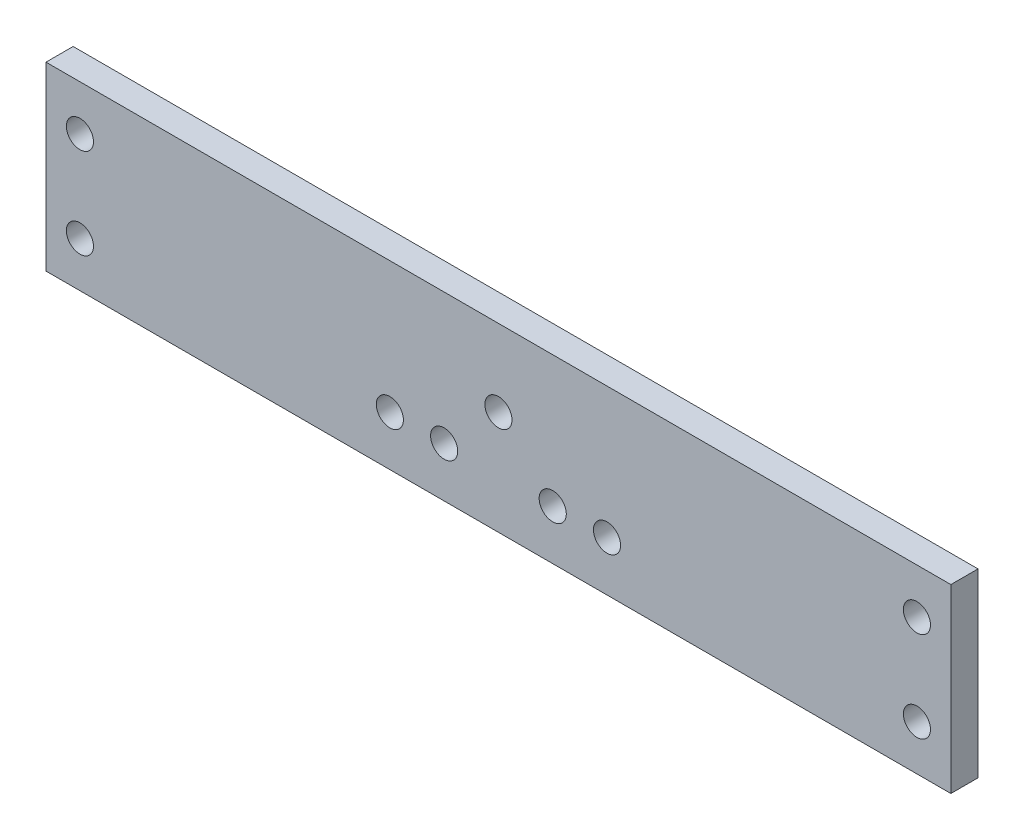
ISO-10303-21;
HEADER;
FILE_DESCRIPTION(('STEP AP214'),'2;1');
FILE_NAME('part.step','',(''),(''),'','','');
FILE_SCHEMA(('AUTOMOTIVE_DESIGN { 1 0 10303 214 1 1 1 1 }'));
ENDSEC;
DATA;
#1=APPLICATION_CONTEXT('core data for automotive mechanical design processes');
#2=APPLICATION_PROTOCOL_DEFINITION('international standard','automotive_design',2000,#1);
#3=PRODUCT_CONTEXT('',#1,'mechanical');
#4=PRODUCT('Part','Part','',(#3));
#5=PRODUCT_RELATED_PRODUCT_CATEGORY('part','',(#4));
#6=PRODUCT_DEFINITION_FORMATION('','',#4);
#7=PRODUCT_DEFINITION_CONTEXT('part definition',#1,'design');
#8=PRODUCT_DEFINITION('design','',#6,#7);
#9=PRODUCT_DEFINITION_SHAPE('','',#8);
#10=(LENGTH_UNIT() NAMED_UNIT(*) SI_UNIT(.MILLI.,.METRE.));
#11=(NAMED_UNIT(*) PLANE_ANGLE_UNIT() SI_UNIT($,.RADIAN.));
#12=(NAMED_UNIT(*) SI_UNIT($,.STERADIAN.) SOLID_ANGLE_UNIT());
#13=UNCERTAINTY_MEASURE_WITH_UNIT(LENGTH_MEASURE(1.E-05),#10,'distance_accuracy_value','');
#14=(GEOMETRIC_REPRESENTATION_CONTEXT(3) GLOBAL_UNCERTAINTY_ASSIGNED_CONTEXT((#13)) GLOBAL_UNIT_ASSIGNED_CONTEXT((#10,
#11,#12)) REPRESENTATION_CONTEXT('',''));
#15=CARTESIAN_POINT('',(0.,0.,0.));
#16=DIRECTION('',(0.,0.,1.));
#17=DIRECTION('',(1.,0.,0.));
#18=AXIS2_PLACEMENT_3D('',#15,#16,#17);
#19=CARTESIAN_POINT('',(0.,-10.,3.));
#20=DIRECTION('',(0.,1.,0.));
#21=DIRECTION('',(-1.,0.,0.));
#22=AXIS2_PLACEMENT_3D('',#19,#20,#21);
#23=PLANE('',#22);
#24=DIRECTION('',(1.,0.,0.));
#25=VECTOR('',#24,1.);
#26=CARTESIAN_POINT('',(0.,-10.,0.));
#27=LINE('',#26,#25);
#28=CARTESIAN_POINT('',(-50.,-9.99999999999999,0.));
#29=VERTEX_POINT('',#28);
#30=CARTESIAN_POINT('',(50.,-10.,0.));
#31=VERTEX_POINT('',#30);
#32=EDGE_CURVE('E146',#29,#31,#27,.T.);
#33=ORIENTED_EDGE('',*,*,#32,.T.);
#34=DIRECTION('',(0.,0.,-1.));
#35=VECTOR('',#34,1.);
#36=CARTESIAN_POINT('',(50.,-10.,3.));
#37=LINE('',#36,#35);
#38=CARTESIAN_POINT('',(50.,-10.,3.));
#39=VERTEX_POINT('',#38);
#40=EDGE_CURVE('E11',#39,#31,#37,.T.);
#41=ORIENTED_EDGE('',*,*,#40,.F.);
#42=DIRECTION('',(1.,0.,0.));
#43=VECTOR('',#42,1.);
#44=CARTESIAN_POINT('',(0.,-10.,3.));
#45=LINE('',#44,#43);
#46=CARTESIAN_POINT('',(-50.,-9.99999999999999,3.));
#47=VERTEX_POINT('',#46);
#48=EDGE_CURVE('E92',#47,#39,#45,.T.);
#49=ORIENTED_EDGE('',*,*,#48,.F.);
#50=DIRECTION('',(0.,0.,-1.));
#51=VECTOR('',#50,1.);
#52=CARTESIAN_POINT('',(-50.,-9.99999999999999,3.));
#53=LINE('',#52,#51);
#54=EDGE_CURVE('E59',#47,#29,#53,.T.);
#55=ORIENTED_EDGE('',*,*,#54,.T.);
#56=EDGE_LOOP('',(#33,#41,#49,#55));
#57=FACE_BOUND('',#56,.T.);
#58=ADVANCED_FACE('F41',(#57),#23,.F.);
#59=CARTESIAN_POINT('',(50.,0.,3.));
#60=DIRECTION('',(-1.,0.,0.));
#61=DIRECTION('',(0.,0.,1.));
#62=AXIS2_PLACEMENT_3D('',#59,#60,#61);
#63=PLANE('',#62);
#64=DIRECTION('',(0.,1.,0.));
#65=VECTOR('',#64,1.);
#66=CARTESIAN_POINT('',(50.,0.,0.));
#67=LINE('',#66,#65);
#68=CARTESIAN_POINT('',(50.,10.,0.));
#69=VERTEX_POINT('',#68);
#70=EDGE_CURVE('E98',#31,#69,#67,.T.);
#71=ORIENTED_EDGE('',*,*,#70,.T.);
#72=DIRECTION('',(0.,0.,-1.));
#73=VECTOR('',#72,1.);
#74=CARTESIAN_POINT('',(50.,10.,3.));
#75=LINE('',#74,#73);
#76=CARTESIAN_POINT('',(50.,10.,3.));
#77=VERTEX_POINT('',#76);
#78=EDGE_CURVE('E51',#77,#69,#75,.T.);
#79=ORIENTED_EDGE('',*,*,#78,.F.);
#80=DIRECTION('',(0.,1.,0.));
#81=VECTOR('',#80,1.);
#82=CARTESIAN_POINT('',(50.,0.,3.));
#83=LINE('',#82,#81);
#84=EDGE_CURVE('E84',#39,#77,#83,.T.);
#85=ORIENTED_EDGE('',*,*,#84,.F.);
#86=ORIENTED_EDGE('',*,*,#40,.T.);
#87=EDGE_LOOP('',(#71,#79,#85,#86));
#88=FACE_BOUND('',#87,.T.);
#89=ADVANCED_FACE('F97',(#88),#63,.F.);
#90=CARTESIAN_POINT('',(0.,10.,3.));
#91=DIRECTION('',(0.,1.,0.));
#92=DIRECTION('',(0.,0.,1.));
#93=AXIS2_PLACEMENT_3D('',#90,#91,#92);
#94=PLANE('',#93);
#95=DIRECTION('',(1.,0.,0.));
#96=VECTOR('',#95,1.);
#97=CARTESIAN_POINT('',(0.,10.,0.));
#98=LINE('',#97,#96);
#99=CARTESIAN_POINT('',(-50.,9.99999999999999,0.));
#100=VERTEX_POINT('',#99);
#101=EDGE_CURVE('E151',#100,#69,#98,.T.);
#102=ORIENTED_EDGE('',*,*,#101,.F.);
#103=DIRECTION('',(0.,0.,-1.));
#104=VECTOR('',#103,1.);
#105=CARTESIAN_POINT('',(-50.,9.99999999999999,3.));
#106=LINE('',#105,#104);
#107=CARTESIAN_POINT('',(-50.,9.99999999999999,3.));
#108=VERTEX_POINT('',#107);
#109=EDGE_CURVE('E73',#108,#100,#106,.T.);
#110=ORIENTED_EDGE('',*,*,#109,.F.);
#111=DIRECTION('',(1.,0.,0.));
#112=VECTOR('',#111,1.);
#113=CARTESIAN_POINT('',(0.,10.,3.));
#114=LINE('',#113,#112);
#115=EDGE_CURVE('E91',#108,#77,#114,.T.);
#116=ORIENTED_EDGE('',*,*,#115,.T.);
#117=ORIENTED_EDGE('',*,*,#78,.T.);
#118=EDGE_LOOP('',(#102,#110,#116,#117));
#119=FACE_BOUND('',#118,.T.);
#120=ADVANCED_FACE('F102',(#119),#94,.T.);
#121=CARTESIAN_POINT('',(46.25,5.,3.));
#122=DIRECTION('',(0.,0.,-1.));
#123=DIRECTION('',(-1.,0.,0.));
#124=AXIS2_PLACEMENT_3D('',#121,#122,#123);
#125=CYLINDRICAL_SURFACE('',#124,1.5);
#126=CARTESIAN_POINT('',(46.25,5.,3.));
#127=DIRECTION('',(0.,0.,1.));
#128=DIRECTION('',(1.,0.,0.));
#129=AXIS2_PLACEMENT_3D('',#126,#127,#128);
#130=CIRCLE('',#129,1.5);
#131=CARTESIAN_POINT('',(47.75,5.,3.));
#132=VERTEX_POINT('',#131);
#133=EDGE_CURVE('E197',#132,#132,#130,.T.);
#134=ORIENTED_EDGE('',*,*,#133,.T.);
#135=EDGE_LOOP('',(#134));
#136=FACE_BOUND('',#135,.T.);
#137=CARTESIAN_POINT('',(46.25,5.,0.));
#138=DIRECTION('',(0.,0.,1.));
#139=DIRECTION('',(1.,0.,0.));
#140=AXIS2_PLACEMENT_3D('',#137,#138,#139);
#141=CIRCLE('',#140,1.5);
#142=CARTESIAN_POINT('',(47.75,5.,0.));
#143=VERTEX_POINT('',#142);
#144=EDGE_CURVE('E142',#143,#143,#141,.T.);
#145=ORIENTED_EDGE('',*,*,#144,.F.);
#146=EDGE_LOOP('',(#145));
#147=FACE_BOUND('',#146,.T.);
#148=ADVANCED_FACE('F203',(#136,#147),#125,.F.);
#149=CARTESIAN_POINT('',(46.25,-5.,3.));
#150=DIRECTION('',(0.,0.,-1.));
#151=DIRECTION('',(-1.,0.,0.));
#152=AXIS2_PLACEMENT_3D('',#149,#150,#151);
#153=CYLINDRICAL_SURFACE('',#152,1.5);
#154=CARTESIAN_POINT('',(46.25,-5.,3.));
#155=DIRECTION('',(0.,0.,1.));
#156=DIRECTION('',(1.,0.,0.));
#157=AXIS2_PLACEMENT_3D('',#154,#155,#156);
#158=CIRCLE('',#157,1.5);
#159=CARTESIAN_POINT('',(47.75,-5.,3.));
#160=VERTEX_POINT('',#159);
#161=EDGE_CURVE('E193',#160,#160,#158,.T.);
#162=ORIENTED_EDGE('',*,*,#161,.T.);
#163=EDGE_LOOP('',(#162));
#164=FACE_BOUND('',#163,.T.);
#165=CARTESIAN_POINT('',(46.25,-5.,0.));
#166=DIRECTION('',(0.,0.,1.));
#167=DIRECTION('',(1.,0.,0.));
#168=AXIS2_PLACEMENT_3D('',#165,#166,#167);
#169=CIRCLE('',#168,1.5);
#170=CARTESIAN_POINT('',(47.75,-5.,0.));
#171=VERTEX_POINT('',#170);
#172=EDGE_CURVE('E138',#171,#171,#169,.T.);
#173=ORIENTED_EDGE('',*,*,#172,.F.);
#174=EDGE_LOOP('',(#173));
#175=FACE_BOUND('',#174,.T.);
#176=ADVANCED_FACE('F229',(#164,#175),#153,.F.);
#177=CARTESIAN_POINT('',(-46.25,5.,3.));
#178=DIRECTION('',(0.,0.,-1.));
#179=DIRECTION('',(-1.,0.,0.));
#180=AXIS2_PLACEMENT_3D('',#177,#178,#179);
#181=CYLINDRICAL_SURFACE('',#180,1.5);
#182=CARTESIAN_POINT('',(-46.25,5.,3.));
#183=DIRECTION('',(0.,0.,1.));
#184=DIRECTION('',(1.,0.,0.));
#185=AXIS2_PLACEMENT_3D('',#182,#183,#184);
#186=CIRCLE('',#185,1.5);
#187=CARTESIAN_POINT('',(-44.75,5.,3.));
#188=VERTEX_POINT('',#187);
#189=EDGE_CURVE('E189',#188,#188,#186,.T.);
#190=ORIENTED_EDGE('',*,*,#189,.T.);
#191=EDGE_LOOP('',(#190));
#192=FACE_BOUND('',#191,.T.);
#193=CARTESIAN_POINT('',(-46.25,5.,0.));
#194=DIRECTION('',(0.,0.,1.));
#195=DIRECTION('',(1.,0.,0.));
#196=AXIS2_PLACEMENT_3D('',#193,#194,#195);
#197=CIRCLE('',#196,1.5);
#198=CARTESIAN_POINT('',(-44.75,5.,0.));
#199=VERTEX_POINT('',#198);
#200=EDGE_CURVE('E134',#199,#199,#197,.T.);
#201=ORIENTED_EDGE('',*,*,#200,.F.);
#202=EDGE_LOOP('',(#201));
#203=FACE_BOUND('',#202,.T.);
#204=ADVANCED_FACE('F232',(#192,#203),#181,.F.);
#205=CARTESIAN_POINT('',(-46.25,-5.,3.));
#206=DIRECTION('',(0.,0.,-1.));
#207=DIRECTION('',(-1.,0.,0.));
#208=AXIS2_PLACEMENT_3D('',#205,#206,#207);
#209=CYLINDRICAL_SURFACE('',#208,1.5);
#210=CARTESIAN_POINT('',(-46.25,-5.,3.));
#211=DIRECTION('',(0.,0.,1.));
#212=DIRECTION('',(1.,0.,0.));
#213=AXIS2_PLACEMENT_3D('',#210,#211,#212);
#214=CIRCLE('',#213,1.5);
#215=CARTESIAN_POINT('',(-44.75,-5.,3.));
#216=VERTEX_POINT('',#215);
#217=EDGE_CURVE('E185',#216,#216,#214,.T.);
#218=ORIENTED_EDGE('',*,*,#217,.T.);
#219=EDGE_LOOP('',(#218));
#220=FACE_BOUND('',#219,.T.);
#221=CARTESIAN_POINT('',(-46.25,-5.,0.));
#222=DIRECTION('',(0.,0.,1.));
#223=DIRECTION('',(1.,0.,0.));
#224=AXIS2_PLACEMENT_3D('',#221,#222,#223);
#225=CIRCLE('',#224,1.5);
#226=CARTESIAN_POINT('',(-44.75,-5.,0.));
#227=VERTEX_POINT('',#226);
#228=EDGE_CURVE('E130',#227,#227,#225,.T.);
#229=ORIENTED_EDGE('',*,*,#228,.F.);
#230=EDGE_LOOP('',(#229));
#231=FACE_BOUND('',#230,.T.);
#232=ADVANCED_FACE('F236',(#220,#231),#209,.F.);
#233=CARTESIAN_POINT('',(0.,1.5,3.));
#234=DIRECTION('',(0.,0.,-1.));
#235=DIRECTION('',(-1.,0.,0.));
#236=AXIS2_PLACEMENT_3D('',#233,#234,#235);
#237=CYLINDRICAL_SURFACE('',#236,1.5);
#238=CARTESIAN_POINT('',(0.,1.5,3.));
#239=DIRECTION('',(0.,0.,1.));
#240=DIRECTION('',(1.,0.,0.));
#241=AXIS2_PLACEMENT_3D('',#238,#239,#240);
#242=CIRCLE('',#241,1.5);
#243=CARTESIAN_POINT('',(1.5,1.5,3.));
#244=VERTEX_POINT('',#243);
#245=EDGE_CURVE('E181',#244,#244,#242,.T.);
#246=ORIENTED_EDGE('',*,*,#245,.T.);
#247=EDGE_LOOP('',(#246));
#248=FACE_BOUND('',#247,.T.);
#249=CARTESIAN_POINT('',(0.,1.5,0.));
#250=DIRECTION('',(0.,0.,1.));
#251=DIRECTION('',(1.,0.,0.));
#252=AXIS2_PLACEMENT_3D('',#249,#250,#251);
#253=CIRCLE('',#252,1.5);
#254=CARTESIAN_POINT('',(1.5,1.5,0.));
#255=VERTEX_POINT('',#254);
#256=EDGE_CURVE('E126',#255,#255,#253,.T.);
#257=ORIENTED_EDGE('',*,*,#256,.F.);
#258=EDGE_LOOP('',(#257));
#259=FACE_BOUND('',#258,.T.);
#260=ADVANCED_FACE('F240',(#248,#259),#237,.F.);
#261=CARTESIAN_POINT('',(12.,-4.5,3.));
#262=DIRECTION('',(0.,0.,-1.));
#263=DIRECTION('',(-1.,0.,0.));
#264=AXIS2_PLACEMENT_3D('',#261,#262,#263);
#265=CYLINDRICAL_SURFACE('',#264,1.5);
#266=CARTESIAN_POINT('',(12.,-4.5,3.));
#267=DIRECTION('',(0.,0.,1.));
#268=DIRECTION('',(1.,0.,0.));
#269=AXIS2_PLACEMENT_3D('',#266,#267,#268);
#270=CIRCLE('',#269,1.5);
#271=CARTESIAN_POINT('',(13.5,-4.5,3.));
#272=VERTEX_POINT('',#271);
#273=EDGE_CURVE('E177',#272,#272,#270,.T.);
#274=ORIENTED_EDGE('',*,*,#273,.T.);
#275=EDGE_LOOP('',(#274));
#276=FACE_BOUND('',#275,.T.);
#277=CARTESIAN_POINT('',(12.,-4.5,0.));
#278=DIRECTION('',(0.,0.,1.));
#279=DIRECTION('',(1.,0.,0.));
#280=AXIS2_PLACEMENT_3D('',#277,#278,#279);
#281=CIRCLE('',#280,1.5);
#282=CARTESIAN_POINT('',(13.5,-4.5,0.));
#283=VERTEX_POINT('',#282);
#284=EDGE_CURVE('E122',#283,#283,#281,.T.);
#285=ORIENTED_EDGE('',*,*,#284,.F.);
#286=EDGE_LOOP('',(#285));
#287=FACE_BOUND('',#286,.T.);
#288=ADVANCED_FACE('F244',(#276,#287),#265,.F.);
#289=CARTESIAN_POINT('',(6.,-4.5,3.));
#290=DIRECTION('',(0.,0.,-1.));
#291=DIRECTION('',(-1.,0.,0.));
#292=AXIS2_PLACEMENT_3D('',#289,#290,#291);
#293=CYLINDRICAL_SURFACE('',#292,1.5);
#294=CARTESIAN_POINT('',(6.,-4.5,3.));
#295=DIRECTION('',(0.,0.,1.));
#296=DIRECTION('',(1.,0.,0.));
#297=AXIS2_PLACEMENT_3D('',#294,#295,#296);
#298=CIRCLE('',#297,1.5);
#299=CARTESIAN_POINT('',(7.5,-4.5,3.));
#300=VERTEX_POINT('',#299);
#301=EDGE_CURVE('E171',#300,#300,#298,.T.);
#302=ORIENTED_EDGE('',*,*,#301,.T.);
#303=EDGE_LOOP('',(#302));
#304=FACE_BOUND('',#303,.T.);
#305=CARTESIAN_POINT('',(6.,-4.5,0.));
#306=DIRECTION('',(0.,0.,1.));
#307=DIRECTION('',(1.,0.,0.));
#308=AXIS2_PLACEMENT_3D('',#305,#306,#307);
#309=CIRCLE('',#308,1.5);
#310=CARTESIAN_POINT('',(7.5,-4.5,0.));
#311=VERTEX_POINT('',#310);
#312=EDGE_CURVE('E118',#311,#311,#309,.T.);
#313=ORIENTED_EDGE('',*,*,#312,.F.);
#314=EDGE_LOOP('',(#313));
#315=FACE_BOUND('',#314,.T.);
#316=ADVANCED_FACE('F248',(#304,#315),#293,.F.);
#317=CARTESIAN_POINT('',(-6.,-4.5,3.));
#318=DIRECTION('',(0.,0.,-1.));
#319=DIRECTION('',(-1.,0.,0.));
#320=AXIS2_PLACEMENT_3D('',#317,#318,#319);
#321=CYLINDRICAL_SURFACE('',#320,1.5);
#322=CARTESIAN_POINT('',(-6.,-4.5,3.));
#323=DIRECTION('',(0.,0.,1.));
#324=DIRECTION('',(1.,0.,0.));
#325=AXIS2_PLACEMENT_3D('',#322,#323,#324);
#326=CIRCLE('',#325,1.5);
#327=CARTESIAN_POINT('',(-4.5,-4.5,3.));
#328=VERTEX_POINT('',#327);
#329=EDGE_CURVE('E165',#328,#328,#326,.T.);
#330=ORIENTED_EDGE('',*,*,#329,.T.);
#331=EDGE_LOOP('',(#330));
#332=FACE_BOUND('',#331,.T.);
#333=CARTESIAN_POINT('',(-6.,-4.5,0.));
#334=DIRECTION('',(0.,0.,1.));
#335=DIRECTION('',(1.,0.,0.));
#336=AXIS2_PLACEMENT_3D('',#333,#334,#335);
#337=CIRCLE('',#336,1.5);
#338=CARTESIAN_POINT('',(-4.5,-4.5,0.));
#339=VERTEX_POINT('',#338);
#340=EDGE_CURVE('E114',#339,#339,#337,.T.);
#341=ORIENTED_EDGE('',*,*,#340,.F.);
#342=EDGE_LOOP('',(#341));
#343=FACE_BOUND('',#342,.T.);
#344=ADVANCED_FACE('F251',(#332,#343),#321,.F.);
#345=CARTESIAN_POINT('',(-12.,-4.5,3.));
#346=DIRECTION('',(0.,0.,-1.));
#347=DIRECTION('',(-1.,0.,0.));
#348=AXIS2_PLACEMENT_3D('',#345,#346,#347);
#349=CYLINDRICAL_SURFACE('',#348,1.5);
#350=CARTESIAN_POINT('',(-12.,-4.5,3.));
#351=DIRECTION('',(0.,0.,1.));
#352=DIRECTION('',(1.,0.,0.));
#353=AXIS2_PLACEMENT_3D('',#350,#351,#352);
#354=CIRCLE('',#353,1.5);
#355=CARTESIAN_POINT('',(-10.5,-4.5,3.));
#356=VERTEX_POINT('',#355);
#357=EDGE_CURVE('E158',#356,#356,#354,.T.);
#358=ORIENTED_EDGE('',*,*,#357,.T.);
#359=EDGE_LOOP('',(#358));
#360=FACE_BOUND('',#359,.T.);
#361=CARTESIAN_POINT('',(-12.,-4.5,0.));
#362=DIRECTION('',(0.,0.,1.));
#363=DIRECTION('',(1.,0.,0.));
#364=AXIS2_PLACEMENT_3D('',#361,#362,#363);
#365=CIRCLE('',#364,1.5);
#366=CARTESIAN_POINT('',(-10.5,-4.5,0.));
#367=VERTEX_POINT('',#366);
#368=EDGE_CURVE('E110',#367,#367,#365,.T.);
#369=ORIENTED_EDGE('',*,*,#368,.F.);
#370=EDGE_LOOP('',(#369));
#371=FACE_BOUND('',#370,.T.);
#372=ADVANCED_FACE('F43',(#360,#371),#349,.F.);
#373=CARTESIAN_POINT('',(-50.,0.,3.));
#374=DIRECTION('',(-1.,0.,0.));
#375=DIRECTION('',(0.,0.,1.));
#376=AXIS2_PLACEMENT_3D('',#373,#374,#375);
#377=PLANE('',#376);
#378=DIRECTION('',(0.,1.,0.));
#379=VECTOR('',#378,1.);
#380=CARTESIAN_POINT('',(-50.,0.,0.));
#381=LINE('',#380,#379);
#382=EDGE_CURVE('E154',#29,#100,#381,.T.);
#383=ORIENTED_EDGE('',*,*,#382,.F.);
#384=ORIENTED_EDGE('',*,*,#54,.F.);
#385=DIRECTION('',(0.,1.,0.));
#386=VECTOR('',#385,1.);
#387=CARTESIAN_POINT('',(-50.,0.,3.));
#388=LINE('',#387,#386);
#389=EDGE_CURVE('E104',#47,#108,#388,.T.);
#390=ORIENTED_EDGE('',*,*,#389,.T.);
#391=ORIENTED_EDGE('',*,*,#109,.T.);
#392=EDGE_LOOP('',(#383,#384,#390,#391));
#393=FACE_BOUND('',#392,.T.);
#394=ADVANCED_FACE('F208',(#393),#377,.T.);
#395=CARTESIAN_POINT('',(0.,0.,3.));
#396=DIRECTION('',(0.,0.,1.));
#397=DIRECTION('',(1.,0.,0.));
#398=AXIS2_PLACEMENT_3D('',#395,#396,#397);
#399=PLANE('',#398);
#400=ORIENTED_EDGE('',*,*,#357,.F.);
#401=EDGE_LOOP('',(#400));
#402=FACE_BOUND('',#401,.T.);
#403=ORIENTED_EDGE('',*,*,#329,.F.);
#404=EDGE_LOOP('',(#403));
#405=FACE_BOUND('',#404,.T.);
#406=ORIENTED_EDGE('',*,*,#301,.F.);
#407=EDGE_LOOP('',(#406));
#408=FACE_BOUND('',#407,.T.);
#409=ORIENTED_EDGE('',*,*,#273,.F.);
#410=EDGE_LOOP('',(#409));
#411=FACE_BOUND('',#410,.T.);
#412=ORIENTED_EDGE('',*,*,#245,.F.);
#413=EDGE_LOOP('',(#412));
#414=FACE_BOUND('',#413,.T.);
#415=ORIENTED_EDGE('',*,*,#217,.F.);
#416=EDGE_LOOP('',(#415));
#417=FACE_BOUND('',#416,.T.);
#418=ORIENTED_EDGE('',*,*,#189,.F.);
#419=EDGE_LOOP('',(#418));
#420=FACE_BOUND('',#419,.T.);
#421=ORIENTED_EDGE('',*,*,#161,.F.);
#422=EDGE_LOOP('',(#421));
#423=FACE_BOUND('',#422,.T.);
#424=ORIENTED_EDGE('',*,*,#133,.F.);
#425=EDGE_LOOP('',(#424));
#426=FACE_BOUND('',#425,.T.);
#427=ORIENTED_EDGE('',*,*,#48,.T.);
#428=ORIENTED_EDGE('',*,*,#84,.T.);
#429=ORIENTED_EDGE('',*,*,#115,.F.);
#430=ORIENTED_EDGE('',*,*,#389,.F.);
#431=EDGE_LOOP('',(#427,#428,#429,#430));
#432=FACE_BOUND('',#431,.T.);
#433=ADVANCED_FACE('F88',(#402,#405,#408,#411,#414,#417,#420,#423,#426,#432),#399,.T.);
#434=CARTESIAN_POINT('',(0.,0.,0.));
#435=DIRECTION('',(0.,0.,1.));
#436=DIRECTION('',(1.,0.,0.));
#437=AXIS2_PLACEMENT_3D('',#434,#435,#436);
#438=PLANE('',#437);
#439=ORIENTED_EDGE('',*,*,#368,.T.);
#440=EDGE_LOOP('',(#439));
#441=FACE_BOUND('',#440,.T.);
#442=ORIENTED_EDGE('',*,*,#340,.T.);
#443=EDGE_LOOP('',(#442));
#444=FACE_BOUND('',#443,.T.);
#445=ORIENTED_EDGE('',*,*,#312,.T.);
#446=EDGE_LOOP('',(#445));
#447=FACE_BOUND('',#446,.T.);
#448=ORIENTED_EDGE('',*,*,#284,.T.);
#449=EDGE_LOOP('',(#448));
#450=FACE_BOUND('',#449,.T.);
#451=ORIENTED_EDGE('',*,*,#256,.T.);
#452=EDGE_LOOP('',(#451));
#453=FACE_BOUND('',#452,.T.);
#454=ORIENTED_EDGE('',*,*,#228,.T.);
#455=EDGE_LOOP('',(#454));
#456=FACE_BOUND('',#455,.T.);
#457=ORIENTED_EDGE('',*,*,#200,.T.);
#458=EDGE_LOOP('',(#457));
#459=FACE_BOUND('',#458,.T.);
#460=ORIENTED_EDGE('',*,*,#172,.T.);
#461=EDGE_LOOP('',(#460));
#462=FACE_BOUND('',#461,.T.);
#463=ORIENTED_EDGE('',*,*,#144,.T.);
#464=EDGE_LOOP('',(#463));
#465=FACE_BOUND('',#464,.T.);
#466=ORIENTED_EDGE('',*,*,#32,.F.);
#467=ORIENTED_EDGE('',*,*,#382,.T.);
#468=ORIENTED_EDGE('',*,*,#101,.T.);
#469=ORIENTED_EDGE('',*,*,#70,.F.);
#470=EDGE_LOOP('',(#466,#467,#468,#469));
#471=FACE_BOUND('',#470,.T.);
#472=ADVANCED_FACE('F207',(#441,#444,#447,#450,#453,#456,#459,#462,#465,#471),#438,.F.);
#473=CLOSED_SHELL('',(#58,#89,#120,#148,#176,#204,#232,#260,#288,#316,#344,#372,#394,#433,#472));
#474=MANIFOLD_SOLID_BREP('B2',#473);
#475=ADVANCED_BREP_SHAPE_REPRESENTATION('',(#18,#474),#14);
#476=SHAPE_DEFINITION_REPRESENTATION(#9,#475);
ENDSEC;
END-ISO-10303-21;
